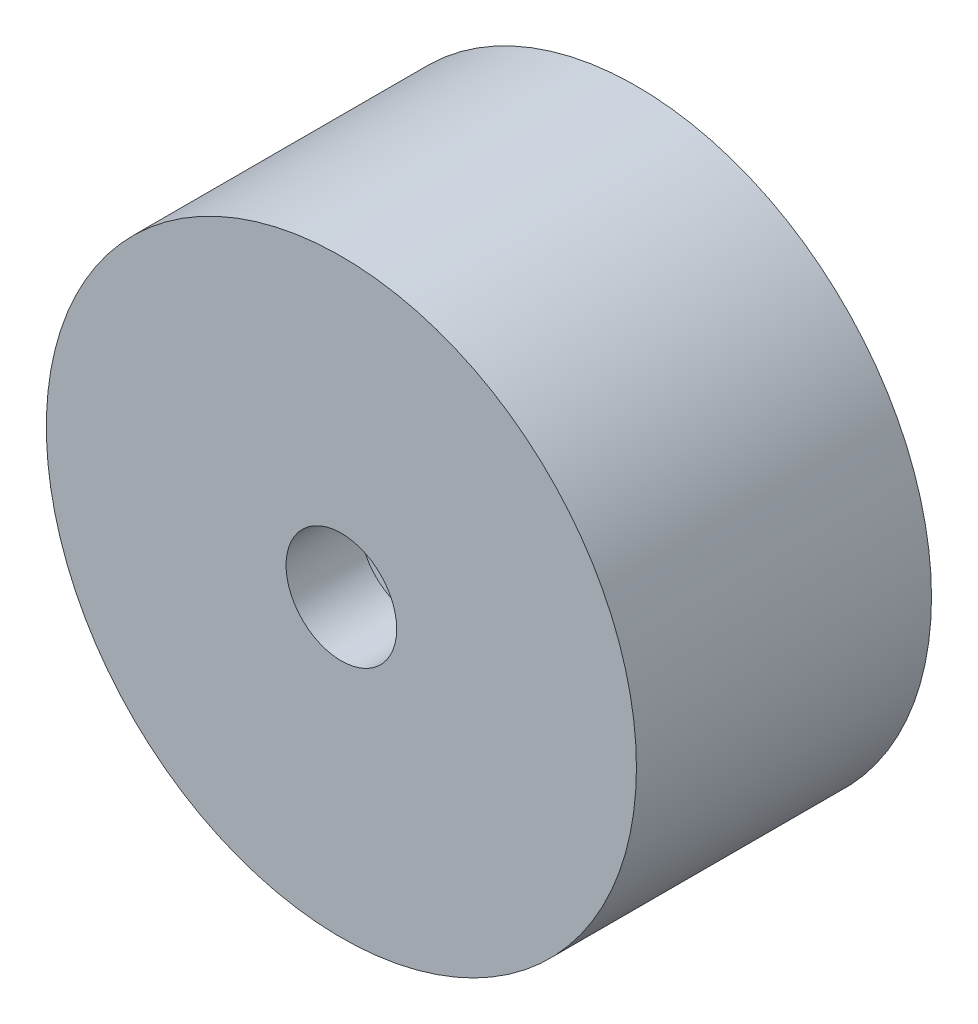
ISO-10303-21;
HEADER;
FILE_DESCRIPTION(('STEP AP214'),'2;1');
FILE_NAME('part.step','',(''),(''),'','','');
FILE_SCHEMA(('AUTOMOTIVE_DESIGN { 1 0 10303 214 1 1 1 1 }'));
ENDSEC;
DATA;
#1=APPLICATION_CONTEXT('core data for automotive mechanical design processes');
#2=APPLICATION_PROTOCOL_DEFINITION('international standard','automotive_design',2000,#1);
#3=PRODUCT_CONTEXT('',#1,'mechanical');
#4=PRODUCT('Part','Part','',(#3));
#5=PRODUCT_RELATED_PRODUCT_CATEGORY('part','',(#4));
#6=PRODUCT_DEFINITION_FORMATION('','',#4);
#7=PRODUCT_DEFINITION_CONTEXT('part definition',#1,'design');
#8=PRODUCT_DEFINITION('design','',#6,#7);
#9=PRODUCT_DEFINITION_SHAPE('','',#8);
#10=(LENGTH_UNIT() NAMED_UNIT(*) SI_UNIT(.MILLI.,.METRE.));
#11=(NAMED_UNIT(*) PLANE_ANGLE_UNIT() SI_UNIT($,.RADIAN.));
#12=(NAMED_UNIT(*) SI_UNIT($,.STERADIAN.) SOLID_ANGLE_UNIT());
#13=UNCERTAINTY_MEASURE_WITH_UNIT(LENGTH_MEASURE(1.E-05),#10,'distance_accuracy_value','');
#14=(GEOMETRIC_REPRESENTATION_CONTEXT(3) GLOBAL_UNCERTAINTY_ASSIGNED_CONTEXT((#13)) GLOBAL_UNIT_ASSIGNED_CONTEXT((#10,
#11,#12)) REPRESENTATION_CONTEXT('',''));
#15=CARTESIAN_POINT('',(0.,0.,0.));
#16=DIRECTION('',(0.,0.,1.));
#17=DIRECTION('',(1.,0.,0.));
#18=AXIS2_PLACEMENT_3D('',#15,#16,#17);
#19=CARTESIAN_POINT('',(0.,0.,8.));
#20=DIRECTION('',(0.,0.,-1.));
#21=DIRECTION('',(-1.,0.,0.));
#22=AXIS2_PLACEMENT_3D('',#19,#20,#21);
#23=CYLINDRICAL_SURFACE('',#22,8.);
#24=CARTESIAN_POINT('',(0.,0.,8.));
#25=DIRECTION('',(0.,0.,1.));
#26=DIRECTION('',(1.,0.,0.));
#27=AXIS2_PLACEMENT_3D('',#24,#25,#26);
#28=CIRCLE('',#27,8.);
#29=CARTESIAN_POINT('',(8.,0.,8.));
#30=VERTEX_POINT('',#29);
#31=EDGE_CURVE('E10',#30,#30,#28,.T.);
#32=ORIENTED_EDGE('',*,*,#31,.F.);
#33=EDGE_LOOP('',(#32));
#34=FACE_BOUND('',#33,.T.);
#35=CARTESIAN_POINT('',(0.,0.,0.));
#36=DIRECTION('',(0.,0.,1.));
#37=DIRECTION('',(1.,0.,0.));
#38=AXIS2_PLACEMENT_3D('',#35,#36,#37);
#39=CIRCLE('',#38,8.);
#40=CARTESIAN_POINT('',(8.,0.,0.));
#41=VERTEX_POINT('',#40);
#42=EDGE_CURVE('E40',#41,#41,#39,.T.);
#43=ORIENTED_EDGE('',*,*,#42,.T.);
#44=EDGE_LOOP('',(#43));
#45=FACE_BOUND('',#44,.T.);
#46=ADVANCED_FACE('F33',(#34,#45),#23,.T.);
#47=CARTESIAN_POINT('',(0.,0.,8.));
#48=DIRECTION('',(0.,0.,1.));
#49=DIRECTION('',(1.,0.,0.));
#50=AXIS2_PLACEMENT_3D('',#47,#48,#49);
#51=PLANE('',#50);
#52=CARTESIAN_POINT('',(0.,0.,8.));
#53=DIRECTION('',(0.,0.,1.));
#54=DIRECTION('',(1.,0.,0.));
#55=AXIS2_PLACEMENT_3D('',#52,#53,#54);
#56=CIRCLE('',#55,1.5);
#57=CARTESIAN_POINT('',(1.5,0.,8.));
#58=VERTEX_POINT('',#57);
#59=EDGE_CURVE('E52',#58,#58,#56,.T.);
#60=ORIENTED_EDGE('',*,*,#59,.F.);
#61=EDGE_LOOP('',(#60));
#62=FACE_BOUND('',#61,.T.);
#63=ORIENTED_EDGE('',*,*,#31,.T.);
#64=EDGE_LOOP('',(#63));
#65=FACE_BOUND('',#64,.T.);
#66=ADVANCED_FACE('F76',(#62,#65),#51,.T.);
#67=CARTESIAN_POINT('',(0.,0.,0.));
#68=DIRECTION('',(0.,0.,1.));
#69=DIRECTION('',(1.,0.,0.));
#70=AXIS2_PLACEMENT_3D('',#67,#68,#69);
#71=PLANE('',#70);
#72=CARTESIAN_POINT('',(0.,0.,0.));
#73=DIRECTION('',(0.,0.,-1.));
#74=DIRECTION('',(-1.,0.,0.));
#75=AXIS2_PLACEMENT_3D('',#72,#73,#74);
#76=CIRCLE('',#75,6.);
#77=CARTESIAN_POINT('',(-6.,0.,0.));
#78=VERTEX_POINT('',#77);
#79=EDGE_CURVE('E47',#78,#78,#76,.T.);
#80=ORIENTED_EDGE('',*,*,#79,.F.);
#81=EDGE_LOOP('',(#80));
#82=FACE_BOUND('',#81,.T.);
#83=ORIENTED_EDGE('',*,*,#42,.F.);
#84=EDGE_LOOP('',(#83));
#85=FACE_BOUND('',#84,.T.);
#86=ADVANCED_FACE('F70',(#82,#85),#71,.F.);
#87=CARTESIAN_POINT('',(0.,0.,6.));
#88=DIRECTION('',(0.,0.,-1.));
#89=DIRECTION('',(-1.,0.,0.));
#90=AXIS2_PLACEMENT_3D('',#87,#88,#89);
#91=CYLINDRICAL_SURFACE('',#90,6.);
#92=CARTESIAN_POINT('',(0.,0.,6.));
#93=DIRECTION('',(0.,0.,-1.));
#94=DIRECTION('',(-1.,0.,0.));
#95=AXIS2_PLACEMENT_3D('',#92,#93,#94);
#96=CIRCLE('',#95,6.);
#97=CARTESIAN_POINT('',(-6.,0.,6.));
#98=VERTEX_POINT('',#97);
#99=EDGE_CURVE('E45',#98,#98,#96,.T.);
#100=ORIENTED_EDGE('',*,*,#99,.F.);
#101=EDGE_LOOP('',(#100));
#102=FACE_BOUND('',#101,.T.);
#103=ORIENTED_EDGE('',*,*,#79,.T.);
#104=EDGE_LOOP('',(#103));
#105=FACE_BOUND('',#104,.T.);
#106=ADVANCED_FACE('F64',(#102,#105),#91,.F.);
#107=CARTESIAN_POINT('',(0.,0.,6.));
#108=DIRECTION('',(0.,0.,-1.));
#109=DIRECTION('',(-1.,0.,0.));
#110=AXIS2_PLACEMENT_3D('',#107,#108,#109);
#111=PLANE('',#110);
#112=CARTESIAN_POINT('',(0.,0.,6.));
#113=DIRECTION('',(0.,0.,-1.));
#114=DIRECTION('',(-1.,0.,0.));
#115=AXIS2_PLACEMENT_3D('',#112,#113,#114);
#116=CIRCLE('',#115,1.5);
#117=CARTESIAN_POINT('',(-1.5,0.,6.));
#118=VERTEX_POINT('',#117);
#119=EDGE_CURVE('E36',#118,#118,#116,.T.);
#120=ORIENTED_EDGE('',*,*,#119,.F.);
#121=EDGE_LOOP('',(#120));
#122=FACE_BOUND('',#121,.T.);
#123=ORIENTED_EDGE('',*,*,#99,.T.);
#124=EDGE_LOOP('',(#123));
#125=FACE_BOUND('',#124,.T.);
#126=ADVANCED_FACE('F61',(#122,#125),#111,.T.);
#127=CARTESIAN_POINT('',(0.,0.,0.));
#128=DIRECTION('',(0.,0.,1.));
#129=DIRECTION('',(1.,0.,0.));
#130=AXIS2_PLACEMENT_3D('',#127,#128,#129);
#131=CYLINDRICAL_SURFACE('',#130,1.5);
#132=ORIENTED_EDGE('',*,*,#119,.T.);
#133=EDGE_LOOP('',(#132));
#134=FACE_BOUND('',#133,.T.);
#135=ORIENTED_EDGE('',*,*,#59,.T.);
#136=EDGE_LOOP('',(#135));
#137=FACE_BOUND('',#136,.T.);
#138=ADVANCED_FACE('F59',(#134,#137),#131,.F.);
#139=CLOSED_SHELL('',(#46,#66,#86,#106,#126,#138));
#140=MANIFOLD_SOLID_BREP('B2',#139);
#141=ADVANCED_BREP_SHAPE_REPRESENTATION('',(#18,#140),#14);
#142=SHAPE_DEFINITION_REPRESENTATION(#9,#141);
ENDSEC;
END-ISO-10303-21;
